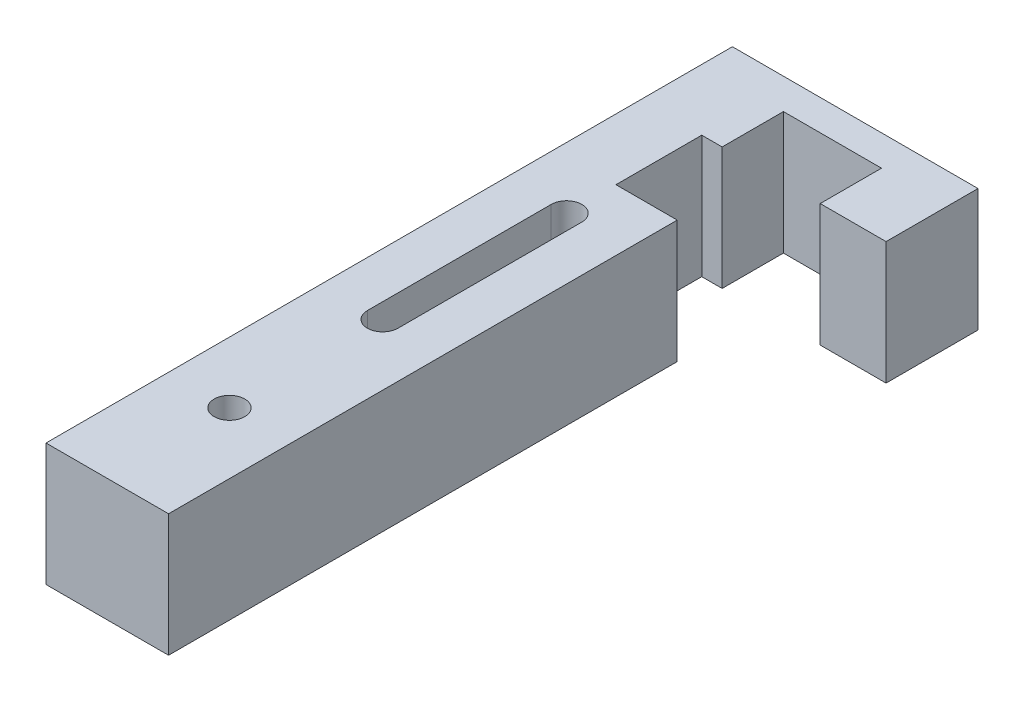
ISO-10303-21;
HEADER;
FILE_DESCRIPTION(('STEP AP214'),'2;1');
FILE_NAME('part.step','',(''),(''),'','','');
FILE_SCHEMA(('AUTOMOTIVE_DESIGN { 1 0 10303 214 1 1 1 1 }'));
ENDSEC;
DATA;
#1=APPLICATION_CONTEXT('core data for automotive mechanical design processes');
#2=APPLICATION_PROTOCOL_DEFINITION('international standard','automotive_design',2000,#1);
#3=PRODUCT_CONTEXT('',#1,'mechanical');
#4=PRODUCT('Part','Part','',(#3));
#5=PRODUCT_RELATED_PRODUCT_CATEGORY('part','',(#4));
#6=PRODUCT_DEFINITION_FORMATION('','',#4);
#7=PRODUCT_DEFINITION_CONTEXT('part definition',#1,'design');
#8=PRODUCT_DEFINITION('design','',#6,#7);
#9=PRODUCT_DEFINITION_SHAPE('','',#8);
#10=(LENGTH_UNIT() NAMED_UNIT(*) SI_UNIT(.MILLI.,.METRE.));
#11=(NAMED_UNIT(*) PLANE_ANGLE_UNIT() SI_UNIT($,.RADIAN.));
#12=(NAMED_UNIT(*) SI_UNIT($,.STERADIAN.) SOLID_ANGLE_UNIT());
#13=UNCERTAINTY_MEASURE_WITH_UNIT(LENGTH_MEASURE(1.E-05),#10,'distance_accuracy_value','');
#14=(GEOMETRIC_REPRESENTATION_CONTEXT(3) GLOBAL_UNCERTAINTY_ASSIGNED_CONTEXT((#13)) GLOBAL_UNIT_ASSIGNED_CONTEXT((#10,
#11,#12)) REPRESENTATION_CONTEXT('',''));
#15=CARTESIAN_POINT('',(0.,0.,0.));
#16=DIRECTION('',(0.,0.,1.));
#17=DIRECTION('',(1.,0.,0.));
#18=AXIS2_PLACEMENT_3D('',#15,#16,#17);
#19=CARTESIAN_POINT('',(38.1967271489522,25.4,-72.39));
#20=DIRECTION('',(0.,0.,1.));
#21=DIRECTION('',(1.,0.,0.));
#22=AXIS2_PLACEMENT_3D('',#19,#20,#21);
#23=PLANE('',#22);
#24=DIRECTION('',(0.,1.,0.));
#25=VECTOR('',#24,1.);
#26=CARTESIAN_POINT('',(24.5477395164934,25.4,-72.39));
#27=LINE('',#26,#25);
#28=CARTESIAN_POINT('',(24.5477395164934,0.,-72.39));
#29=VERTEX_POINT('',#28);
#30=CARTESIAN_POINT('',(24.5477395164934,25.4,-72.39));
#31=VERTEX_POINT('',#30);
#32=EDGE_CURVE('E48',#29,#31,#27,.T.);
#33=ORIENTED_EDGE('',*,*,#32,.F.);
#34=DIRECTION('',(-1.,0.,0.));
#35=VECTOR('',#34,1.);
#36=CARTESIAN_POINT('',(38.1967271489522,0.,-72.39));
#37=LINE('',#36,#35);
#38=CARTESIAN_POINT('',(38.1967271489522,0.,-72.39));
#39=VERTEX_POINT('',#38);
#40=EDGE_CURVE('E215',#39,#29,#37,.T.);
#41=ORIENTED_EDGE('',*,*,#40,.F.);
#42=DIRECTION('',(0.,-1.,0.));
#43=VECTOR('',#42,1.);
#44=CARTESIAN_POINT('',(38.1967271489522,25.4,-72.39));
#45=LINE('',#44,#43);
#46=CARTESIAN_POINT('',(38.1967271489522,25.4,-72.39));
#47=VERTEX_POINT('',#46);
#48=EDGE_CURVE('E210',#47,#39,#45,.T.);
#49=ORIENTED_EDGE('',*,*,#48,.F.);
#50=DIRECTION('',(-1.,0.,0.));
#51=VECTOR('',#50,1.);
#52=CARTESIAN_POINT('',(38.1967271489522,25.4,-72.39));
#53=LINE('',#52,#51);
#54=EDGE_CURVE('E195',#47,#31,#53,.T.);
#55=ORIENTED_EDGE('',*,*,#54,.T.);
#56=EDGE_LOOP('',(#33,#41,#49,#55));
#57=FACE_BOUND('',#56,.T.);
#58=ADVANCED_FACE('F39',(#57),#23,.T.);
#59=CARTESIAN_POINT('',(12.7,25.4,50.8));
#60=DIRECTION('',(-1.,0.,0.));
#61=DIRECTION('',(0.,0.,1.));
#62=AXIS2_PLACEMENT_3D('',#59,#60,#61);
#63=PLANE('',#62);
#64=DIRECTION('',(0.,0.,-1.));
#65=VECTOR('',#64,1.);
#66=CARTESIAN_POINT('',(12.7,0.,50.8));
#67=LINE('',#66,#65);
#68=CARTESIAN_POINT('',(12.7,0.,50.8));
#69=VERTEX_POINT('',#68);
#70=CARTESIAN_POINT('',(12.7,0.,-54.61));
#71=VERTEX_POINT('',#70);
#72=EDGE_CURVE('E286',#69,#71,#67,.T.);
#73=ORIENTED_EDGE('',*,*,#72,.T.);
#74=DIRECTION('',(0.,-1.,0.));
#75=VECTOR('',#74,1.);
#76=CARTESIAN_POINT('',(12.7,25.4,-54.61));
#77=LINE('',#76,#75);
#78=CARTESIAN_POINT('',(12.7,25.4,-54.61));
#79=VERTEX_POINT('',#78);
#80=EDGE_CURVE('E238',#79,#71,#77,.T.);
#81=ORIENTED_EDGE('',*,*,#80,.F.);
#82=DIRECTION('',(0.,0.,-1.));
#83=VECTOR('',#82,1.);
#84=CARTESIAN_POINT('',(12.7,25.4,50.8));
#85=LINE('',#84,#83);
#86=CARTESIAN_POINT('',(12.7,25.4,50.8));
#87=VERTEX_POINT('',#86);
#88=EDGE_CURVE('E301',#87,#79,#85,.T.);
#89=ORIENTED_EDGE('',*,*,#88,.F.);
#90=DIRECTION('',(0.,-1.,0.));
#91=VECTOR('',#90,1.);
#92=CARTESIAN_POINT('',(12.7,25.4,50.8));
#93=LINE('',#92,#91);
#94=EDGE_CURVE('E311',#87,#69,#93,.T.);
#95=ORIENTED_EDGE('',*,*,#94,.T.);
#96=EDGE_LOOP('',(#73,#81,#89,#95));
#97=FACE_BOUND('',#96,.T.);
#98=ADVANCED_FACE('F41',(#97),#63,.F.);
#99=CARTESIAN_POINT('',(-12.7,25.4,50.8));
#100=DIRECTION('',(1.,0.,0.));
#101=DIRECTION('',(0.,0.,-1.));
#102=AXIS2_PLACEMENT_3D('',#99,#100,#101);
#103=PLANE('',#102);
#104=DIRECTION('',(0.,0.,1.));
#105=VECTOR('',#104,1.);
#106=CARTESIAN_POINT('',(-12.7,0.,50.8));
#107=LINE('',#106,#105);
#108=CARTESIAN_POINT('',(-12.7,0.,-91.44));
#109=VERTEX_POINT('',#108);
#110=CARTESIAN_POINT('',(-12.7,0.,50.8));
#111=VERTEX_POINT('',#110);
#112=EDGE_CURVE('E314',#109,#111,#107,.T.);
#113=ORIENTED_EDGE('',*,*,#112,.T.);
#114=DIRECTION('',(0.,-1.,0.));
#115=VECTOR('',#114,1.);
#116=CARTESIAN_POINT('',(-12.7,25.4,50.8));
#117=LINE('',#116,#115);
#118=CARTESIAN_POINT('',(-12.7,25.4,50.8));
#119=VERTEX_POINT('',#118);
#120=EDGE_CURVE('E322',#119,#111,#117,.T.);
#121=ORIENTED_EDGE('',*,*,#120,.F.);
#122=DIRECTION('',(0.,0.,1.));
#123=VECTOR('',#122,1.);
#124=CARTESIAN_POINT('',(-12.7,25.4,50.8));
#125=LINE('',#124,#123);
#126=CARTESIAN_POINT('',(-12.7,25.4,-91.44));
#127=VERTEX_POINT('',#126);
#128=EDGE_CURVE('E304',#127,#119,#125,.T.);
#129=ORIENTED_EDGE('',*,*,#128,.F.);
#130=DIRECTION('',(0.,-1.,0.));
#131=VECTOR('',#130,1.);
#132=CARTESIAN_POINT('',(-12.7,25.4,-91.44));
#133=LINE('',#132,#131);
#134=EDGE_CURVE('E234',#127,#109,#133,.T.);
#135=ORIENTED_EDGE('',*,*,#134,.T.);
#136=EDGE_LOOP('',(#113,#121,#129,#135));
#137=FACE_BOUND('',#136,.T.);
#138=ADVANCED_FACE('F358',(#137),#103,.F.);
#139=CARTESIAN_POINT('',(-12.7,25.4,50.8));
#140=DIRECTION('',(0.,0.,-1.));
#141=DIRECTION('',(-1.,0.,0.));
#142=AXIS2_PLACEMENT_3D('',#139,#140,#141);
#143=PLANE('',#142);
#144=DIRECTION('',(1.,0.,0.));
#145=VECTOR('',#144,1.);
#146=CARTESIAN_POINT('',(-12.7,0.,50.8));
#147=LINE('',#146,#145);
#148=EDGE_CURVE('E305',#111,#69,#147,.T.);
#149=ORIENTED_EDGE('',*,*,#148,.T.);
#150=ORIENTED_EDGE('',*,*,#94,.F.);
#151=DIRECTION('',(1.,0.,0.));
#152=VECTOR('',#151,1.);
#153=CARTESIAN_POINT('',(-12.7,25.4,50.8));
#154=LINE('',#153,#152);
#155=EDGE_CURVE('E308',#119,#87,#154,.T.);
#156=ORIENTED_EDGE('',*,*,#155,.F.);
#157=ORIENTED_EDGE('',*,*,#120,.T.);
#158=EDGE_LOOP('',(#149,#150,#156,#157));
#159=FACE_BOUND('',#158,.T.);
#160=ADVANCED_FACE('F355',(#159),#143,.F.);
#161=CARTESIAN_POINT('',(0.,25.4,0.));
#162=DIRECTION('',(0.,-1.,0.));
#163=DIRECTION('',(0.,0.,-1.));
#164=AXIS2_PLACEMENT_3D('',#161,#162,#163);
#165=PLANE('',#164);
#166=DIRECTION('',(0.,0.,1.));
#167=VECTOR('',#166,1.);
#168=CARTESIAN_POINT('',(-3.175,25.4,-44.369602703525));
#169=LINE('',#168,#167);
#170=CARTESIAN_POINT('',(-3.175,25.4,-44.369602703525));
#171=VERTEX_POINT('',#170);
#172=CARTESIAN_POINT('',(-3.175,25.4,-6.26960270352497));
#173=VERTEX_POINT('',#172);
#174=EDGE_CURVE('E271',#171,#173,#169,.T.);
#175=ORIENTED_EDGE('',*,*,#174,.F.);
#176=CARTESIAN_POINT('',(0.,25.4,-44.369602703525));
#177=DIRECTION('',(0.,1.,0.));
#178=DIRECTION('',(0.,0.,1.));
#179=AXIS2_PLACEMENT_3D('',#176,#177,#178);
#180=CIRCLE('',#179,3.175);
#181=CARTESIAN_POINT('',(3.175,25.4,-44.369602703525));
#182=VERTEX_POINT('',#181);
#183=EDGE_CURVE('E63',#182,#171,#180,.T.);
#184=ORIENTED_EDGE('',*,*,#183,.F.);
#185=DIRECTION('',(0.,0.,-1.));
#186=VECTOR('',#185,1.);
#187=CARTESIAN_POINT('',(3.175,25.4,-44.369602703525));
#188=LINE('',#187,#186);
#189=CARTESIAN_POINT('',(3.175,25.4,-6.26960270352497));
#190=VERTEX_POINT('',#189);
#191=EDGE_CURVE('E256',#190,#182,#188,.T.);
#192=ORIENTED_EDGE('',*,*,#191,.F.);
#193=CARTESIAN_POINT('',(0.,25.4,-6.26960270352497));
#194=DIRECTION('',(0.,1.,0.));
#195=DIRECTION('',(0.,0.,1.));
#196=AXIS2_PLACEMENT_3D('',#193,#194,#195);
#197=CIRCLE('',#196,3.175);
#198=EDGE_CURVE('E276',#173,#190,#197,.T.);
#199=ORIENTED_EDGE('',*,*,#198,.F.);
#200=EDGE_LOOP('',(#175,#184,#192,#199));
#201=FACE_BOUND('',#200,.T.);
#202=CARTESIAN_POINT('',(0.,25.4,25.480397296475));
#203=DIRECTION('',(0.,1.,0.));
#204=DIRECTION('',(0.,0.,1.));
#205=AXIS2_PLACEMENT_3D('',#202,#203,#204);
#206=CIRCLE('',#205,3.175);
#207=CARTESIAN_POINT('',(0.,25.4,28.655397296475));
#208=VERTEX_POINT('',#207);
#209=EDGE_CURVE('E233',#208,#208,#206,.T.);
#210=ORIENTED_EDGE('',*,*,#209,.F.);
#211=EDGE_LOOP('',(#210));
#212=FACE_BOUND('',#211,.T.);
#213=DIRECTION('',(-1.,0.,0.));
#214=VECTOR('',#213,1.);
#215=CARTESIAN_POINT('',(4.22773951649341,25.4,-85.09));
#216=LINE('',#215,#214);
#217=CARTESIAN_POINT('',(24.5477395164934,25.4,-85.09));
#218=VERTEX_POINT('',#217);
#219=CARTESIAN_POINT('',(4.22773951649341,25.4,-85.09));
#220=VERTEX_POINT('',#219);
#221=EDGE_CURVE('E157',#218,#220,#216,.T.);
#222=ORIENTED_EDGE('',*,*,#221,.F.);
#223=DIRECTION('',(0.,0.,-1.));
#224=VECTOR('',#223,1.);
#225=CARTESIAN_POINT('',(24.5477395164934,25.4,-85.09));
#226=LINE('',#225,#224);
#227=EDGE_CURVE('E165',#31,#218,#226,.T.);
#228=ORIENTED_EDGE('',*,*,#227,.F.);
#229=ORIENTED_EDGE('',*,*,#54,.F.);
#230=DIRECTION('',(0.,0.,1.));
#231=VECTOR('',#230,1.);
#232=CARTESIAN_POINT('',(38.1967271489522,25.4,-91.44));
#233=LINE('',#232,#231);
#234=CARTESIAN_POINT('',(38.1967271489522,25.4,-91.44));
#235=VERTEX_POINT('',#234);
#236=EDGE_CURVE('E189',#235,#47,#233,.T.);
#237=ORIENTED_EDGE('',*,*,#236,.F.);
#238=DIRECTION('',(1.,0.,0.));
#239=VECTOR('',#238,1.);
#240=CARTESIAN_POINT('',(-12.7,25.4,-91.44));
#241=LINE('',#240,#239);
#242=EDGE_CURVE('E206',#127,#235,#241,.T.);
#243=ORIENTED_EDGE('',*,*,#242,.F.);
#244=ORIENTED_EDGE('',*,*,#128,.T.);
#245=ORIENTED_EDGE('',*,*,#155,.T.);
#246=ORIENTED_EDGE('',*,*,#88,.T.);
#247=DIRECTION('',(1.,0.,0.));
#248=VECTOR('',#247,1.);
#249=CARTESIAN_POINT('',(0.,25.4,-54.61));
#250=LINE('',#249,#248);
#251=CARTESIAN_POINT('',(0.,25.4,-54.61));
#252=VERTEX_POINT('',#251);
#253=EDGE_CURVE('E202',#252,#79,#250,.T.);
#254=ORIENTED_EDGE('',*,*,#253,.F.);
#255=DIRECTION('',(0.,0.,1.));
#256=VECTOR('',#255,1.);
#257=CARTESIAN_POINT('',(0.,25.4,-72.39));
#258=LINE('',#257,#256);
#259=CARTESIAN_POINT('',(0.,25.4,-72.39));
#260=VERTEX_POINT('',#259);
#261=EDGE_CURVE('E198',#260,#252,#258,.T.);
#262=ORIENTED_EDGE('',*,*,#261,.F.);
#263=CARTESIAN_POINT('',(4.22773951649342,25.4,-72.39));
#264=VERTEX_POINT('',#263);
#265=EDGE_CURVE('E193',#264,#260,#53,.T.);
#266=ORIENTED_EDGE('',*,*,#265,.F.);
#267=DIRECTION('',(0.,0.,1.));
#268=VECTOR('',#267,1.);
#269=CARTESIAN_POINT('',(4.22773951649341,25.4,-85.09));
#270=LINE('',#269,#268);
#271=EDGE_CURVE('E55',#220,#264,#270,.T.);
#272=ORIENTED_EDGE('',*,*,#271,.F.);
#273=EDGE_LOOP('',(#222,#228,#229,#237,#243,#244,#245,#246,#254,#262,#266,#272));
#274=FACE_BOUND('',#273,.T.);
#275=ADVANCED_FACE('F173',(#201,#212,#274),#165,.F.);
#276=CARTESIAN_POINT('',(0.,0.,0.));
#277=DIRECTION('',(0.,-1.,0.));
#278=DIRECTION('',(0.,0.,-1.));
#279=AXIS2_PLACEMENT_3D('',#276,#277,#278);
#280=PLANE('',#279);
#281=DIRECTION('',(0.,0.,1.));
#282=VECTOR('',#281,1.);
#283=CARTESIAN_POINT('',(24.5477395164934,0.,0.));
#284=LINE('',#283,#282);
#285=CARTESIAN_POINT('',(24.5477395164934,0.,-85.09));
#286=VERTEX_POINT('',#285);
#287=EDGE_CURVE('E185',#286,#29,#284,.T.);
#288=ORIENTED_EDGE('',*,*,#287,.F.);
#289=DIRECTION('',(1.,0.,0.));
#290=VECTOR('',#289,1.);
#291=CARTESIAN_POINT('',(0.,0.,-85.09));
#292=LINE('',#291,#290);
#293=CARTESIAN_POINT('',(4.22773951649341,0.,-85.09));
#294=VERTEX_POINT('',#293);
#295=EDGE_CURVE('E11',#294,#286,#292,.T.);
#296=ORIENTED_EDGE('',*,*,#295,.F.);
#297=DIRECTION('',(0.,0.,-1.));
#298=VECTOR('',#297,1.);
#299=CARTESIAN_POINT('',(4.22773951649343,0.,0.));
#300=LINE('',#299,#298);
#301=CARTESIAN_POINT('',(4.22773951649342,0.,-72.39));
#302=VERTEX_POINT('',#301);
#303=EDGE_CURVE('E181',#302,#294,#300,.T.);
#304=ORIENTED_EDGE('',*,*,#303,.F.);
#305=CARTESIAN_POINT('',(0.,0.,-72.39));
#306=VERTEX_POINT('',#305);
#307=EDGE_CURVE('E214',#302,#306,#37,.T.);
#308=ORIENTED_EDGE('',*,*,#307,.T.);
#309=DIRECTION('',(0.,0.,1.));
#310=VECTOR('',#309,1.);
#311=CARTESIAN_POINT('',(0.,0.,-72.39));
#312=LINE('',#311,#310);
#313=CARTESIAN_POINT('',(0.,0.,-54.61));
#314=VERTEX_POINT('',#313);
#315=EDGE_CURVE('E219',#306,#314,#312,.T.);
#316=ORIENTED_EDGE('',*,*,#315,.T.);
#317=DIRECTION('',(1.,0.,0.));
#318=VECTOR('',#317,1.);
#319=CARTESIAN_POINT('',(0.,0.,-54.61));
#320=LINE('',#319,#318);
#321=EDGE_CURVE('E223',#314,#71,#320,.T.);
#322=ORIENTED_EDGE('',*,*,#321,.T.);
#323=ORIENTED_EDGE('',*,*,#72,.F.);
#324=ORIENTED_EDGE('',*,*,#148,.F.);
#325=ORIENTED_EDGE('',*,*,#112,.F.);
#326=DIRECTION('',(1.,0.,0.));
#327=VECTOR('',#326,1.);
#328=CARTESIAN_POINT('',(-12.7,0.,-91.44));
#329=LINE('',#328,#327);
#330=CARTESIAN_POINT('',(38.1967271489522,0.,-91.44));
#331=VERTEX_POINT('',#330);
#332=EDGE_CURVE('E194',#109,#331,#329,.T.);
#333=ORIENTED_EDGE('',*,*,#332,.T.);
#334=DIRECTION('',(0.,0.,1.));
#335=VECTOR('',#334,1.);
#336=CARTESIAN_POINT('',(38.1967271489522,0.,-91.44));
#337=LINE('',#336,#335);
#338=EDGE_CURVE('E188',#331,#39,#337,.T.);
#339=ORIENTED_EDGE('',*,*,#338,.T.);
#340=ORIENTED_EDGE('',*,*,#40,.T.);
#341=EDGE_LOOP('',(#288,#296,#304,#308,#316,#322,#323,#324,#325,#333,#339,#340));
#342=FACE_BOUND('',#341,.T.);
#343=CARTESIAN_POINT('',(0.,0.,-44.369602703525));
#344=DIRECTION('',(0.,1.,0.));
#345=DIRECTION('',(0.,0.,1.));
#346=AXIS2_PLACEMENT_3D('',#343,#344,#345);
#347=CIRCLE('',#346,3.175);
#348=CARTESIAN_POINT('',(3.175,0.,-44.369602703525));
#349=VERTEX_POINT('',#348);
#350=CARTESIAN_POINT('',(-3.175,0.,-44.369602703525));
#351=VERTEX_POINT('',#350);
#352=EDGE_CURVE('E251',#349,#351,#347,.T.);
#353=ORIENTED_EDGE('',*,*,#352,.T.);
#354=DIRECTION('',(0.,0.,1.));
#355=VECTOR('',#354,1.);
#356=CARTESIAN_POINT('',(-3.175,0.,-44.369602703525));
#357=LINE('',#356,#355);
#358=CARTESIAN_POINT('',(-3.175,0.,-6.26960270352497));
#359=VERTEX_POINT('',#358);
#360=EDGE_CURVE('E255',#351,#359,#357,.T.);
#361=ORIENTED_EDGE('',*,*,#360,.T.);
#362=CARTESIAN_POINT('',(0.,0.,-6.26960270352497));
#363=DIRECTION('',(0.,1.,0.));
#364=DIRECTION('',(0.,0.,1.));
#365=AXIS2_PLACEMENT_3D('',#362,#363,#364);
#366=CIRCLE('',#365,3.175);
#367=CARTESIAN_POINT('',(3.175,0.,-6.26960270352497));
#368=VERTEX_POINT('',#367);
#369=EDGE_CURVE('E260',#359,#368,#366,.T.);
#370=ORIENTED_EDGE('',*,*,#369,.T.);
#371=DIRECTION('',(0.,0.,-1.));
#372=VECTOR('',#371,1.);
#373=CARTESIAN_POINT('',(3.175,0.,-44.369602703525));
#374=LINE('',#373,#372);
#375=EDGE_CURVE('E264',#368,#349,#374,.T.);
#376=ORIENTED_EDGE('',*,*,#375,.T.);
#377=EDGE_LOOP('',(#353,#361,#370,#376));
#378=FACE_BOUND('',#377,.T.);
#379=CARTESIAN_POINT('',(0.,0.,25.480397296475));
#380=DIRECTION('',(0.,1.,0.));
#381=DIRECTION('',(0.,0.,1.));
#382=AXIS2_PLACEMENT_3D('',#379,#380,#381);
#383=CIRCLE('',#382,3.175);
#384=CARTESIAN_POINT('',(0.,0.,28.655397296475));
#385=VERTEX_POINT('',#384);
#386=EDGE_CURVE('E272',#385,#385,#383,.T.);
#387=ORIENTED_EDGE('',*,*,#386,.T.);
#388=EDGE_LOOP('',(#387));
#389=FACE_BOUND('',#388,.T.);
#390=ADVANCED_FACE('F334',(#342,#378,#389),#280,.T.);
#391=CARTESIAN_POINT('',(0.,0.,25.480397296475));
#392=DIRECTION('',(0.,1.,0.));
#393=DIRECTION('',(0.,0.,1.));
#394=AXIS2_PLACEMENT_3D('',#391,#392,#393);
#395=CYLINDRICAL_SURFACE('',#394,3.175);
#396=ORIENTED_EDGE('',*,*,#386,.F.);
#397=EDGE_LOOP('',(#396));
#398=FACE_BOUND('',#397,.T.);
#399=ORIENTED_EDGE('',*,*,#209,.T.);
#400=EDGE_LOOP('',(#399));
#401=FACE_BOUND('',#400,.T.);
#402=ADVANCED_FACE('F450',(#398,#401),#395,.F.);
#403=CARTESIAN_POINT('',(0.,0.,-44.369602703525));
#404=DIRECTION('',(0.,1.,0.));
#405=DIRECTION('',(0.,0.,1.));
#406=AXIS2_PLACEMENT_3D('',#403,#404,#405);
#407=CYLINDRICAL_SURFACE('',#406,3.175);
#408=ORIENTED_EDGE('',*,*,#183,.T.);
#409=DIRECTION('',(0.,1.,0.));
#410=VECTOR('',#409,1.);
#411=CARTESIAN_POINT('',(-3.175,0.,-44.369602703525));
#412=LINE('',#411,#410);
#413=EDGE_CURVE('E268',#351,#171,#412,.T.);
#414=ORIENTED_EDGE('',*,*,#413,.F.);
#415=ORIENTED_EDGE('',*,*,#352,.F.);
#416=DIRECTION('',(0.,1.,0.));
#417=VECTOR('',#416,1.);
#418=CARTESIAN_POINT('',(3.175,0.,-44.369602703525));
#419=LINE('',#418,#417);
#420=EDGE_CURVE('E283',#349,#182,#419,.T.);
#421=ORIENTED_EDGE('',*,*,#420,.T.);
#422=EDGE_LOOP('',(#408,#414,#415,#421));
#423=FACE_BOUND('',#422,.T.);
#424=ADVANCED_FACE('F506',(#423),#407,.F.);
#425=CARTESIAN_POINT('',(3.175,0.,-44.369602703525));
#426=DIRECTION('',(1.,0.,0.));
#427=DIRECTION('',(0.,0.,-1.));
#428=AXIS2_PLACEMENT_3D('',#425,#426,#427);
#429=PLANE('',#428);
#430=ORIENTED_EDGE('',*,*,#191,.T.);
#431=ORIENTED_EDGE('',*,*,#420,.F.);
#432=ORIENTED_EDGE('',*,*,#375,.F.);
#433=DIRECTION('',(0.,1.,0.));
#434=VECTOR('',#433,1.);
#435=CARTESIAN_POINT('',(3.175,0.,-6.26960270352497));
#436=LINE('',#435,#434);
#437=EDGE_CURVE('E287',#368,#190,#436,.T.);
#438=ORIENTED_EDGE('',*,*,#437,.T.);
#439=EDGE_LOOP('',(#430,#431,#432,#438));
#440=FACE_BOUND('',#439,.T.);
#441=ADVANCED_FACE('F497',(#440),#429,.F.);
#442=CARTESIAN_POINT('',(0.,0.,-6.26960270352497));
#443=DIRECTION('',(0.,1.,0.));
#444=DIRECTION('',(0.,0.,1.));
#445=AXIS2_PLACEMENT_3D('',#442,#443,#444);
#446=CYLINDRICAL_SURFACE('',#445,3.175);
#447=ORIENTED_EDGE('',*,*,#198,.T.);
#448=ORIENTED_EDGE('',*,*,#437,.F.);
#449=ORIENTED_EDGE('',*,*,#369,.F.);
#450=DIRECTION('',(0.,1.,0.));
#451=VECTOR('',#450,1.);
#452=CARTESIAN_POINT('',(-3.175,0.,-6.26960270352497));
#453=LINE('',#452,#451);
#454=EDGE_CURVE('E290',#359,#173,#453,.T.);
#455=ORIENTED_EDGE('',*,*,#454,.T.);
#456=EDGE_LOOP('',(#447,#448,#449,#455));
#457=FACE_BOUND('',#456,.T.);
#458=ADVANCED_FACE('F488',(#457),#446,.F.);
#459=CARTESIAN_POINT('',(-3.175,0.,-44.369602703525));
#460=DIRECTION('',(-1.,0.,0.));
#461=DIRECTION('',(0.,0.,1.));
#462=AXIS2_PLACEMENT_3D('',#459,#460,#461);
#463=PLANE('',#462);
#464=ORIENTED_EDGE('',*,*,#174,.T.);
#465=ORIENTED_EDGE('',*,*,#454,.F.);
#466=ORIENTED_EDGE('',*,*,#360,.F.);
#467=ORIENTED_EDGE('',*,*,#413,.T.);
#468=EDGE_LOOP('',(#464,#465,#466,#467));
#469=FACE_BOUND('',#468,.T.);
#470=ADVANCED_FACE('F442',(#469),#463,.F.);
#471=CARTESIAN_POINT('',(38.1967271489522,25.4,-91.44));
#472=DIRECTION('',(1.,0.,0.));
#473=DIRECTION('',(0.,0.,-1.));
#474=AXIS2_PLACEMENT_3D('',#471,#472,#473);
#475=PLANE('',#474);
#476=ORIENTED_EDGE('',*,*,#338,.F.);
#477=DIRECTION('',(0.,-1.,0.));
#478=VECTOR('',#477,1.);
#479=CARTESIAN_POINT('',(38.1967271489522,25.4,-91.44));
#480=LINE('',#479,#478);
#481=EDGE_CURVE('E230',#235,#331,#480,.T.);
#482=ORIENTED_EDGE('',*,*,#481,.F.);
#483=ORIENTED_EDGE('',*,*,#236,.T.);
#484=ORIENTED_EDGE('',*,*,#48,.T.);
#485=EDGE_LOOP('',(#476,#482,#483,#484));
#486=FACE_BOUND('',#485,.T.);
#487=ADVANCED_FACE('F367',(#486),#475,.T.);
#488=CARTESIAN_POINT('',(-12.7,25.4,-91.44));
#489=DIRECTION('',(0.,0.,-1.));
#490=DIRECTION('',(-1.,0.,0.));
#491=AXIS2_PLACEMENT_3D('',#488,#489,#490);
#492=PLANE('',#491);
#493=ORIENTED_EDGE('',*,*,#332,.F.);
#494=ORIENTED_EDGE('',*,*,#134,.F.);
#495=ORIENTED_EDGE('',*,*,#242,.T.);
#496=ORIENTED_EDGE('',*,*,#481,.T.);
#497=EDGE_LOOP('',(#493,#494,#495,#496));
#498=FACE_BOUND('',#497,.T.);
#499=ADVANCED_FACE('F363',(#498),#492,.T.);
#500=CARTESIAN_POINT('',(0.,25.4,-54.61));
#501=DIRECTION('',(0.,0.,-1.));
#502=DIRECTION('',(-1.,0.,0.));
#503=AXIS2_PLACEMENT_3D('',#500,#501,#502);
#504=PLANE('',#503);
#505=ORIENTED_EDGE('',*,*,#321,.F.);
#506=DIRECTION('',(0.,-1.,0.));
#507=VECTOR('',#506,1.);
#508=CARTESIAN_POINT('',(0.,25.4,-54.61));
#509=LINE('',#508,#507);
#510=EDGE_CURVE('E242',#252,#314,#509,.T.);
#511=ORIENTED_EDGE('',*,*,#510,.F.);
#512=ORIENTED_EDGE('',*,*,#253,.T.);
#513=ORIENTED_EDGE('',*,*,#80,.T.);
#514=EDGE_LOOP('',(#505,#511,#512,#513));
#515=FACE_BOUND('',#514,.T.);
#516=ADVANCED_FACE('F346',(#515),#504,.T.);
#517=CARTESIAN_POINT('',(0.,25.4,-72.39));
#518=DIRECTION('',(1.,0.,0.));
#519=DIRECTION('',(0.,0.,-1.));
#520=AXIS2_PLACEMENT_3D('',#517,#518,#519);
#521=PLANE('',#520);
#522=ORIENTED_EDGE('',*,*,#315,.F.);
#523=DIRECTION('',(0.,-1.,0.));
#524=VECTOR('',#523,1.);
#525=CARTESIAN_POINT('',(0.,25.4,-72.39));
#526=LINE('',#525,#524);
#527=EDGE_CURVE('E245',#260,#306,#526,.T.);
#528=ORIENTED_EDGE('',*,*,#527,.F.);
#529=ORIENTED_EDGE('',*,*,#261,.T.);
#530=ORIENTED_EDGE('',*,*,#510,.T.);
#531=EDGE_LOOP('',(#522,#528,#529,#530));
#532=FACE_BOUND('',#531,.T.);
#533=ADVANCED_FACE('F342',(#532),#521,.T.);
#534=DIRECTION('',(0.,-1.,0.));
#535=VECTOR('',#534,1.);
#536=CARTESIAN_POINT('',(4.22773951649341,25.4,-72.39));
#537=LINE('',#536,#535);
#538=EDGE_CURVE('E326',#264,#302,#537,.T.);
#539=ORIENTED_EDGE('',*,*,#538,.F.);
#540=ORIENTED_EDGE('',*,*,#265,.T.);
#541=ORIENTED_EDGE('',*,*,#527,.T.);
#542=ORIENTED_EDGE('',*,*,#307,.F.);
#543=EDGE_LOOP('',(#539,#540,#541,#542));
#544=FACE_BOUND('',#543,.T.);
#545=ADVANCED_FACE('F339',(#544),#23,.T.);
#546=CARTESIAN_POINT('',(24.5477395164934,-127.,-85.09));
#547=DIRECTION('',(1.,0.,0.));
#548=DIRECTION('',(0.,0.,-1.));
#549=AXIS2_PLACEMENT_3D('',#546,#547,#548);
#550=PLANE('',#549);
#551=ORIENTED_EDGE('',*,*,#287,.T.);
#552=ORIENTED_EDGE('',*,*,#32,.T.);
#553=ORIENTED_EDGE('',*,*,#227,.T.);
#554=DIRECTION('',(0.,1.,0.));
#555=VECTOR('',#554,1.);
#556=CARTESIAN_POINT('',(24.5477395164934,-127.,-85.09));
#557=LINE('',#556,#555);
#558=EDGE_CURVE('E152',#286,#218,#557,.T.);
#559=ORIENTED_EDGE('',*,*,#558,.F.);
#560=EDGE_LOOP('',(#551,#552,#553,#559));
#561=FACE_BOUND('',#560,.T.);
#562=ADVANCED_FACE('F166',(#561),#550,.F.);
#563=CARTESIAN_POINT('',(4.22773951649341,-127.,-85.09));
#564=DIRECTION('',(-1.,0.,0.));
#565=DIRECTION('',(0.,0.,1.));
#566=AXIS2_PLACEMENT_3D('',#563,#564,#565);
#567=PLANE('',#566);
#568=ORIENTED_EDGE('',*,*,#303,.T.);
#569=DIRECTION('',(0.,1.,0.));
#570=VECTOR('',#569,1.);
#571=CARTESIAN_POINT('',(4.22773951649341,-127.,-85.09));
#572=LINE('',#571,#570);
#573=EDGE_CURVE('E162',#294,#220,#572,.T.);
#574=ORIENTED_EDGE('',*,*,#573,.T.);
#575=ORIENTED_EDGE('',*,*,#271,.T.);
#576=ORIENTED_EDGE('',*,*,#538,.T.);
#577=EDGE_LOOP('',(#568,#574,#575,#576));
#578=FACE_BOUND('',#577,.T.);
#579=ADVANCED_FACE('F382',(#578),#567,.F.);
#580=CARTESIAN_POINT('',(4.22773951649341,-127.,-85.09));
#581=DIRECTION('',(0.,0.,-1.));
#582=DIRECTION('',(-1.,0.,0.));
#583=AXIS2_PLACEMENT_3D('',#580,#581,#582);
#584=PLANE('',#583);
#585=ORIENTED_EDGE('',*,*,#295,.T.);
#586=ORIENTED_EDGE('',*,*,#558,.T.);
#587=ORIENTED_EDGE('',*,*,#221,.T.);
#588=ORIENTED_EDGE('',*,*,#573,.F.);
#589=EDGE_LOOP('',(#585,#586,#587,#588));
#590=FACE_BOUND('',#589,.T.);
#591=ADVANCED_FACE('F154',(#590),#584,.F.);
#592=CLOSED_SHELL('',(#58,#98,#138,#160,#275,#390,#402,#424,#441,#458,#470,#487,#499,#516,#533,
#545,#562,#579,#591));
#593=MANIFOLD_SOLID_BREP('B2',#592);
#594=ADVANCED_BREP_SHAPE_REPRESENTATION('',(#18,#593),#14);
#595=SHAPE_DEFINITION_REPRESENTATION(#9,#594);
ENDSEC;
END-ISO-10303-21;
